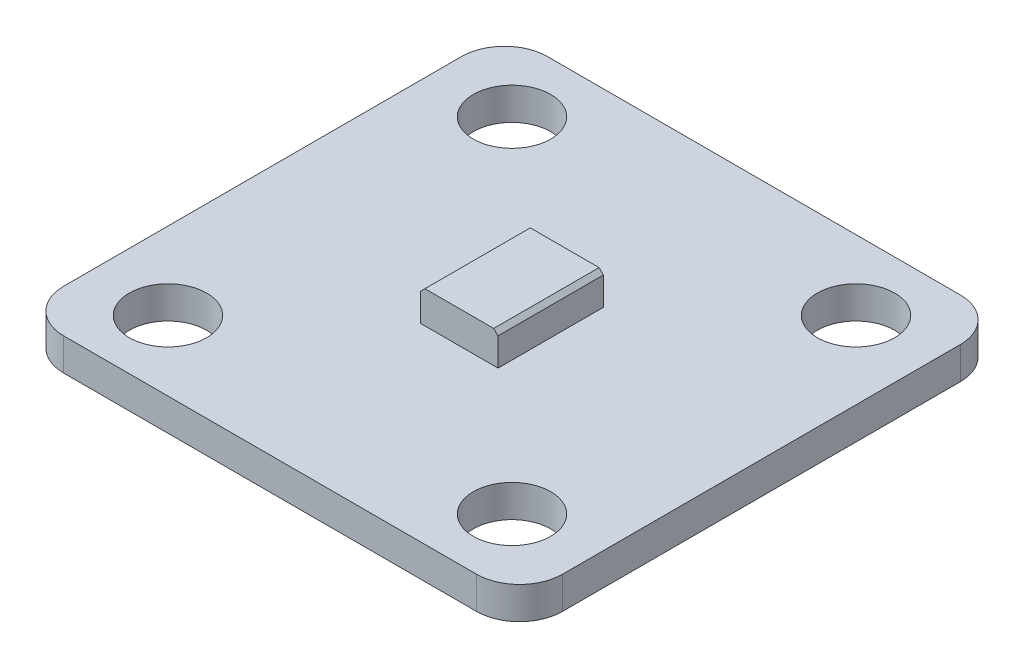
ISO-10303-21;
HEADER;
FILE_DESCRIPTION(('STEP AP214'),'2;1');
FILE_NAME('part.step','',(''),(''),'','','');
FILE_SCHEMA(('AUTOMOTIVE_DESIGN { 1 0 10303 214 1 1 1 1 }'));
ENDSEC;
DATA;
#1=APPLICATION_CONTEXT('core data for automotive mechanical design processes');
#2=APPLICATION_PROTOCOL_DEFINITION('international standard','automotive_design',2000,#1);
#3=PRODUCT_CONTEXT('',#1,'mechanical');
#4=PRODUCT('Part','Part','',(#3));
#5=PRODUCT_RELATED_PRODUCT_CATEGORY('part','',(#4));
#6=PRODUCT_DEFINITION_FORMATION('','',#4);
#7=PRODUCT_DEFINITION_CONTEXT('part definition',#1,'design');
#8=PRODUCT_DEFINITION('design','',#6,#7);
#9=PRODUCT_DEFINITION_SHAPE('','',#8);
#10=(LENGTH_UNIT() NAMED_UNIT(*) SI_UNIT(.MILLI.,.METRE.));
#11=(NAMED_UNIT(*) PLANE_ANGLE_UNIT() SI_UNIT($,.RADIAN.));
#12=(NAMED_UNIT(*) SI_UNIT($,.STERADIAN.) SOLID_ANGLE_UNIT());
#13=UNCERTAINTY_MEASURE_WITH_UNIT(LENGTH_MEASURE(1.E-05),#10,'distance_accuracy_value','');
#14=(GEOMETRIC_REPRESENTATION_CONTEXT(3) GLOBAL_UNCERTAINTY_ASSIGNED_CONTEXT((#13)) GLOBAL_UNIT_ASSIGNED_CONTEXT((#10,
#11,#12)) REPRESENTATION_CONTEXT('',''));
#15=CARTESIAN_POINT('',(0.,0.,0.));
#16=DIRECTION('',(0.,0.,1.));
#17=DIRECTION('',(1.,0.,0.));
#18=AXIS2_PLACEMENT_3D('',#15,#16,#17);
#19=CARTESIAN_POINT('',(0.,1.5,0.));
#20=DIRECTION('',(0.,1.,0.));
#21=DIRECTION('',(0.,0.,1.));
#22=AXIS2_PLACEMENT_3D('',#19,#20,#21);
#23=PLANE('',#22);
#24=CARTESIAN_POINT('',(8.,1.5,8.00000000000045));
#25=DIRECTION('',(0.,-1.,0.));
#26=DIRECTION('',(0.,0.,-1.));
#27=AXIS2_PLACEMENT_3D('',#24,#25,#26);
#28=CIRCLE('',#27,1.80000000000046);
#29=CARTESIAN_POINT('',(8.,1.5,6.19999999999999));
#30=VERTEX_POINT('',#29);
#31=EDGE_CURVE('E203',#30,#30,#28,.T.);
#32=ORIENTED_EDGE('',*,*,#31,.T.);
#33=EDGE_LOOP('',(#32));
#34=FACE_BOUND('',#33,.T.);
#35=CARTESIAN_POINT('',(-7.99999999999955,1.5,-8.00000000000001));
#36=DIRECTION('',(0.,-1.,0.));
#37=DIRECTION('',(0.,0.,-1.));
#38=AXIS2_PLACEMENT_3D('',#35,#36,#37);
#39=CIRCLE('',#38,1.80000000000024);
#40=CARTESIAN_POINT('',(-7.99999999999955,1.5,-9.80000000000024));
#41=VERTEX_POINT('',#40);
#42=EDGE_CURVE('E194',#41,#41,#39,.T.);
#43=ORIENTED_EDGE('',*,*,#42,.T.);
#44=EDGE_LOOP('',(#43));
#45=FACE_BOUND('',#44,.T.);
#46=CARTESIAN_POINT('',(8.00000000000045,1.5,-7.99999999999955));
#47=DIRECTION('',(0.,-1.,0.));
#48=DIRECTION('',(0.,0.,-1.));
#49=AXIS2_PLACEMENT_3D('',#46,#47,#48);
#50=CIRCLE('',#49,1.80000000000063);
#51=CARTESIAN_POINT('',(8.00000000000045,1.5,-9.80000000000018));
#52=VERTEX_POINT('',#51);
#53=EDGE_CURVE('E157',#52,#52,#50,.T.);
#54=ORIENTED_EDGE('',*,*,#53,.T.);
#55=EDGE_LOOP('',(#54));
#56=FACE_BOUND('',#55,.T.);
#57=CARTESIAN_POINT('',(-8.,1.5,8.));
#58=DIRECTION('',(0.,-1.,0.));
#59=DIRECTION('',(0.,0.,-1.));
#60=AXIS2_PLACEMENT_3D('',#57,#58,#59);
#61=CIRCLE('',#60,1.8);
#62=CARTESIAN_POINT('',(-8.,1.5,6.2));
#63=VERTEX_POINT('',#62);
#64=EDGE_CURVE('E214',#63,#63,#61,.T.);
#65=ORIENTED_EDGE('',*,*,#64,.T.);
#66=EDGE_LOOP('',(#65));
#67=FACE_BOUND('',#66,.T.);
#68=DIRECTION('',(-1.,0.,0.));
#69=VECTOR('',#68,1.);
#70=CARTESIAN_POINT('',(-11.6,1.5,-11.25));
#71=LINE('',#70,#69);
#72=CARTESIAN_POINT('',(9.59999999999999,1.5,-11.25));
#73=VERTEX_POINT('',#72);
#74=CARTESIAN_POINT('',(-9.6,1.5,-11.25));
#75=VERTEX_POINT('',#74);
#76=EDGE_CURVE('E226',#73,#75,#71,.T.);
#77=ORIENTED_EDGE('',*,*,#76,.T.);
#78=CARTESIAN_POINT('',(-9.6,1.5,-9.25));
#79=DIRECTION('',(0.,1.,0.));
#80=DIRECTION('',(0.,0.,1.));
#81=AXIS2_PLACEMENT_3D('',#78,#79,#80);
#82=CIRCLE('',#81,2.);
#83=CARTESIAN_POINT('',(-11.6,1.5,-9.25000000000001));
#84=VERTEX_POINT('',#83);
#85=EDGE_CURVE('E288',#75,#84,#82,.T.);
#86=ORIENTED_EDGE('',*,*,#85,.T.);
#87=DIRECTION('',(0.,0.,1.));
#88=VECTOR('',#87,1.);
#89=CARTESIAN_POINT('',(-11.6,1.5,-11.25));
#90=LINE('',#89,#88);
#91=CARTESIAN_POINT('',(-11.6,1.5,9.24999999999999));
#92=VERTEX_POINT('',#91);
#93=EDGE_CURVE('E231',#84,#92,#90,.T.);
#94=ORIENTED_EDGE('',*,*,#93,.T.);
#95=CARTESIAN_POINT('',(-9.6,1.5,9.25));
#96=DIRECTION('',(0.,1.,0.));
#97=DIRECTION('',(0.,0.,1.));
#98=AXIS2_PLACEMENT_3D('',#95,#96,#97);
#99=CIRCLE('',#98,2.);
#100=CARTESIAN_POINT('',(-9.6,1.5,11.25));
#101=VERTEX_POINT('',#100);
#102=EDGE_CURVE('E282',#92,#101,#99,.T.);
#103=ORIENTED_EDGE('',*,*,#102,.T.);
#104=DIRECTION('',(1.,0.,0.));
#105=VECTOR('',#104,1.);
#106=CARTESIAN_POINT('',(-11.6,1.5,11.25));
#107=LINE('',#106,#105);
#108=CARTESIAN_POINT('',(9.6,1.5,11.25));
#109=VERTEX_POINT('',#108);
#110=EDGE_CURVE('E235',#101,#109,#107,.T.);
#111=ORIENTED_EDGE('',*,*,#110,.T.);
#112=CARTESIAN_POINT('',(9.6,1.5,9.24999999999999));
#113=DIRECTION('',(0.,1.,0.));
#114=DIRECTION('',(0.,0.,1.));
#115=AXIS2_PLACEMENT_3D('',#112,#113,#114);
#116=CIRCLE('',#115,2.);
#117=CARTESIAN_POINT('',(11.6,1.5,9.24999999999999));
#118=VERTEX_POINT('',#117);
#119=EDGE_CURVE('E279',#109,#118,#116,.T.);
#120=ORIENTED_EDGE('',*,*,#119,.T.);
#121=DIRECTION('',(0.,0.,-1.));
#122=VECTOR('',#121,1.);
#123=CARTESIAN_POINT('',(11.6,1.5,-11.25));
#124=LINE('',#123,#122);
#125=CARTESIAN_POINT('',(11.6,1.5,-9.25000000000001));
#126=VERTEX_POINT('',#125);
#127=EDGE_CURVE('E222',#118,#126,#124,.T.);
#128=ORIENTED_EDGE('',*,*,#127,.T.);
#129=CARTESIAN_POINT('',(9.59999999999999,1.5,-9.25));
#130=DIRECTION('',(0.,1.,0.));
#131=DIRECTION('',(0.,0.,1.));
#132=AXIS2_PLACEMENT_3D('',#129,#130,#131);
#133=CIRCLE('',#132,2.);
#134=EDGE_CURVE('E285',#126,#73,#133,.T.);
#135=ORIENTED_EDGE('',*,*,#134,.T.);
#136=EDGE_LOOP('',(#77,#86,#94,#103,#111,#120,#128,#135));
#137=FACE_BOUND('',#136,.T.);
#138=DIRECTION('',(-1.,0.,0.));
#139=VECTOR('',#138,1.);
#140=CARTESIAN_POINT('',(-1.8,1.5,-2.45));
#141=LINE('',#140,#139);
#142=CARTESIAN_POINT('',(1.8,1.5,-2.45));
#143=VERTEX_POINT('',#142);
#144=CARTESIAN_POINT('',(-1.8,1.5,-2.45));
#145=VERTEX_POINT('',#144);
#146=EDGE_CURVE('E153',#143,#145,#141,.T.);
#147=ORIENTED_EDGE('',*,*,#146,.F.);
#148=DIRECTION('',(0.,0.,-1.));
#149=VECTOR('',#148,1.);
#150=CARTESIAN_POINT('',(1.8,1.5,-2.45));
#151=LINE('',#150,#149);
#152=CARTESIAN_POINT('',(1.8,1.5,2.45));
#153=VERTEX_POINT('',#152);
#154=EDGE_CURVE('E161',#153,#143,#151,.T.);
#155=ORIENTED_EDGE('',*,*,#154,.F.);
#156=DIRECTION('',(1.,0.,0.));
#157=VECTOR('',#156,1.);
#158=CARTESIAN_POINT('',(-1.8,1.5,2.45));
#159=LINE('',#158,#157);
#160=CARTESIAN_POINT('',(-1.8,1.5,2.45));
#161=VERTEX_POINT('',#160);
#162=EDGE_CURVE('E175',#161,#153,#159,.T.);
#163=ORIENTED_EDGE('',*,*,#162,.F.);
#164=DIRECTION('',(0.,0.,1.));
#165=VECTOR('',#164,1.);
#166=CARTESIAN_POINT('',(-1.8,1.5,-2.45));
#167=LINE('',#166,#165);
#168=EDGE_CURVE('E171',#145,#161,#167,.T.);
#169=ORIENTED_EDGE('',*,*,#168,.F.);
#170=EDGE_LOOP('',(#147,#155,#163,#169));
#171=FACE_BOUND('',#170,.T.);
#172=ADVANCED_FACE('F45',(#34,#45,#56,#67,#137,#171),#23,.T.);
#173=CARTESIAN_POINT('',(11.6,1.5,-11.25));
#174=DIRECTION('',(-1.,0.,0.));
#175=DIRECTION('',(0.,0.,1.));
#176=AXIS2_PLACEMENT_3D('',#173,#174,#175);
#177=PLANE('',#176);
#178=DIRECTION('',(0.,0.,-1.));
#179=VECTOR('',#178,1.);
#180=CARTESIAN_POINT('',(11.6,0.,-11.25));
#181=LINE('',#180,#179);
#182=CARTESIAN_POINT('',(11.6,0.,9.24999999999999));
#183=VERTEX_POINT('',#182);
#184=CARTESIAN_POINT('',(11.6,0.,-9.25000000000001));
#185=VERTEX_POINT('',#184);
#186=EDGE_CURVE('E218',#183,#185,#181,.T.);
#187=ORIENTED_EDGE('',*,*,#186,.T.);
#188=DIRECTION('',(0.,-1.,0.));
#189=VECTOR('',#188,1.);
#190=CARTESIAN_POINT('',(11.6,1.5,-9.25));
#191=LINE('',#190,#189);
#192=EDGE_CURVE('E295',#185,#126,#191,.F.);
#193=ORIENTED_EDGE('',*,*,#192,.T.);
#194=ORIENTED_EDGE('',*,*,#127,.F.);
#195=DIRECTION('',(0.,-1.,0.));
#196=VECTOR('',#195,1.);
#197=CARTESIAN_POINT('',(11.6,1.5,9.24999999999999));
#198=LINE('',#197,#196);
#199=EDGE_CURVE('E291',#118,#183,#198,.T.);
#200=ORIENTED_EDGE('',*,*,#199,.T.);
#201=EDGE_LOOP('',(#187,#193,#194,#200));
#202=FACE_BOUND('',#201,.T.);
#203=ADVANCED_FACE('F344',(#202),#177,.F.);
#204=CARTESIAN_POINT('',(-11.6,1.5,-11.25));
#205=DIRECTION('',(0.,0.,1.));
#206=DIRECTION('',(1.,0.,0.));
#207=AXIS2_PLACEMENT_3D('',#204,#205,#206);
#208=PLANE('',#207);
#209=DIRECTION('',(-1.,0.,0.));
#210=VECTOR('',#209,1.);
#211=CARTESIAN_POINT('',(-11.6,0.,-11.25));
#212=LINE('',#211,#210);
#213=CARTESIAN_POINT('',(9.59999999999999,0.,-11.25));
#214=VERTEX_POINT('',#213);
#215=CARTESIAN_POINT('',(-9.6,0.,-11.25));
#216=VERTEX_POINT('',#215);
#217=EDGE_CURVE('E243',#214,#216,#212,.T.);
#218=ORIENTED_EDGE('',*,*,#217,.T.);
#219=DIRECTION('',(0.,-1.,0.));
#220=VECTOR('',#219,1.);
#221=CARTESIAN_POINT('',(-9.6,1.5,-11.25));
#222=LINE('',#221,#220);
#223=EDGE_CURVE('E276',#216,#75,#222,.F.);
#224=ORIENTED_EDGE('',*,*,#223,.T.);
#225=ORIENTED_EDGE('',*,*,#76,.F.);
#226=DIRECTION('',(0.,-1.,0.));
#227=VECTOR('',#226,1.);
#228=CARTESIAN_POINT('',(9.59999999999999,1.5,-11.25));
#229=LINE('',#228,#227);
#230=EDGE_CURVE('E272',#73,#214,#229,.T.);
#231=ORIENTED_EDGE('',*,*,#230,.T.);
#232=EDGE_LOOP('',(#218,#224,#225,#231));
#233=FACE_BOUND('',#232,.T.);
#234=ADVANCED_FACE('F350',(#233),#208,.F.);
#235=CARTESIAN_POINT('',(-11.6,1.5,-11.25));
#236=DIRECTION('',(1.,0.,0.));
#237=DIRECTION('',(0.,0.,-1.));
#238=AXIS2_PLACEMENT_3D('',#235,#236,#237);
#239=PLANE('',#238);
#240=ORIENTED_EDGE('',*,*,#93,.F.);
#241=DIRECTION('',(0.,-1.,0.));
#242=VECTOR('',#241,1.);
#243=CARTESIAN_POINT('',(-11.6,1.5,-9.25));
#244=LINE('',#243,#242);
#245=CARTESIAN_POINT('',(-11.6,0.,-9.25000000000001));
#246=VERTEX_POINT('',#245);
#247=EDGE_CURVE('E256',#84,#246,#244,.T.);
#248=ORIENTED_EDGE('',*,*,#247,.T.);
#249=DIRECTION('',(0.,0.,1.));
#250=VECTOR('',#249,1.);
#251=CARTESIAN_POINT('',(-11.6,0.,-11.25));
#252=LINE('',#251,#250);
#253=CARTESIAN_POINT('',(-11.6,0.,9.24999999999999));
#254=VERTEX_POINT('',#253);
#255=EDGE_CURVE('E247',#246,#254,#252,.T.);
#256=ORIENTED_EDGE('',*,*,#255,.T.);
#257=DIRECTION('',(0.,-1.,0.));
#258=VECTOR('',#257,1.);
#259=CARTESIAN_POINT('',(-11.6,1.5,9.24999999999999));
#260=LINE('',#259,#258);
#261=EDGE_CURVE('E239',#254,#92,#260,.F.);
#262=ORIENTED_EDGE('',*,*,#261,.T.);
#263=EDGE_LOOP('',(#240,#248,#256,#262));
#264=FACE_BOUND('',#263,.T.);
#265=ADVANCED_FACE('F366',(#264),#239,.F.);
#266=CARTESIAN_POINT('',(-11.6,1.5,11.25));
#267=DIRECTION('',(0.,0.,-1.));
#268=DIRECTION('',(-1.,0.,0.));
#269=AXIS2_PLACEMENT_3D('',#266,#267,#268);
#270=PLANE('',#269);
#271=ORIENTED_EDGE('',*,*,#110,.F.);
#272=DIRECTION('',(0.,-1.,0.));
#273=VECTOR('',#272,1.);
#274=CARTESIAN_POINT('',(-9.6,1.5,11.25));
#275=LINE('',#274,#273);
#276=CARTESIAN_POINT('',(-9.6,0.,11.25));
#277=VERTEX_POINT('',#276);
#278=EDGE_CURVE('E301',#101,#277,#275,.T.);
#279=ORIENTED_EDGE('',*,*,#278,.T.);
#280=DIRECTION('',(1.,0.,0.));
#281=VECTOR('',#280,1.);
#282=CARTESIAN_POINT('',(-11.6,0.,11.25));
#283=LINE('',#282,#281);
#284=CARTESIAN_POINT('',(9.6,0.,11.25));
#285=VERTEX_POINT('',#284);
#286=EDGE_CURVE('E227',#277,#285,#283,.T.);
#287=ORIENTED_EDGE('',*,*,#286,.T.);
#288=DIRECTION('',(0.,-1.,0.));
#289=VECTOR('',#288,1.);
#290=CARTESIAN_POINT('',(9.6,1.5,11.25));
#291=LINE('',#290,#289);
#292=EDGE_CURVE('E298',#285,#109,#291,.F.);
#293=ORIENTED_EDGE('',*,*,#292,.T.);
#294=EDGE_LOOP('',(#271,#279,#287,#293));
#295=FACE_BOUND('',#294,.T.);
#296=ADVANCED_FACE('F362',(#295),#270,.F.);
#297=CARTESIAN_POINT('',(0.,0.,0.));
#298=DIRECTION('',(0.,1.,0.));
#299=DIRECTION('',(0.,0.,1.));
#300=AXIS2_PLACEMENT_3D('',#297,#298,#299);
#301=PLANE('',#300);
#302=CARTESIAN_POINT('',(0.,0.,0.));
#303=DIRECTION('',(0.,-1.,0.));
#304=DIRECTION('',(0.,0.,-1.));
#305=AXIS2_PLACEMENT_3D('',#302,#303,#304);
#306=CIRCLE('',#305,0.5);
#307=CARTESIAN_POINT('',(0.,0.,-0.5));
#308=VERTEX_POINT('',#307);
#309=EDGE_CURVE('E472',#308,#308,#306,.T.);
#310=ORIENTED_EDGE('',*,*,#309,.F.);
#311=EDGE_LOOP('',(#310));
#312=FACE_BOUND('',#311,.T.);
#313=CARTESIAN_POINT('',(8.,0.,8.00000000000045));
#314=DIRECTION('',(0.,-1.,0.));
#315=DIRECTION('',(0.,0.,-1.));
#316=AXIS2_PLACEMENT_3D('',#313,#314,#315);
#317=CIRCLE('',#316,1.80000000000046);
#318=CARTESIAN_POINT('',(8.,0.,6.19999999999999));
#319=VERTEX_POINT('',#318);
#320=EDGE_CURVE('E198',#319,#319,#317,.T.);
#321=ORIENTED_EDGE('',*,*,#320,.F.);
#322=EDGE_LOOP('',(#321));
#323=FACE_BOUND('',#322,.T.);
#324=CARTESIAN_POINT('',(-7.99999999999955,0.,-8.00000000000001));
#325=DIRECTION('',(0.,-1.,0.));
#326=DIRECTION('',(0.,0.,-1.));
#327=AXIS2_PLACEMENT_3D('',#324,#325,#326);
#328=CIRCLE('',#327,1.80000000000024);
#329=CARTESIAN_POINT('',(-7.99999999999955,0.,-9.80000000000024));
#330=VERTEX_POINT('',#329);
#331=EDGE_CURVE('E207',#330,#330,#328,.T.);
#332=ORIENTED_EDGE('',*,*,#331,.F.);
#333=EDGE_LOOP('',(#332));
#334=FACE_BOUND('',#333,.T.);
#335=CARTESIAN_POINT('',(8.00000000000045,0.,-7.99999999999955));
#336=DIRECTION('',(0.,-1.,0.));
#337=DIRECTION('',(0.,0.,-1.));
#338=AXIS2_PLACEMENT_3D('',#335,#336,#337);
#339=CIRCLE('',#338,1.80000000000063);
#340=CARTESIAN_POINT('',(8.00000000000045,0.,-9.80000000000018));
#341=VERTEX_POINT('',#340);
#342=EDGE_CURVE('E190',#341,#341,#339,.T.);
#343=ORIENTED_EDGE('',*,*,#342,.F.);
#344=EDGE_LOOP('',(#343));
#345=FACE_BOUND('',#344,.T.);
#346=CARTESIAN_POINT('',(-8.,0.,8.));
#347=DIRECTION('',(0.,-1.,0.));
#348=DIRECTION('',(0.,0.,-1.));
#349=AXIS2_PLACEMENT_3D('',#346,#347,#348);
#350=CIRCLE('',#349,1.8);
#351=CARTESIAN_POINT('',(-8.,0.,6.2));
#352=VERTEX_POINT('',#351);
#353=EDGE_CURVE('E202',#352,#352,#350,.T.);
#354=ORIENTED_EDGE('',*,*,#353,.F.);
#355=EDGE_LOOP('',(#354));
#356=FACE_BOUND('',#355,.T.);
#357=ORIENTED_EDGE('',*,*,#255,.F.);
#358=CARTESIAN_POINT('',(-9.6,0.,-9.25));
#359=DIRECTION('',(0.,1.,0.));
#360=DIRECTION('',(0.,0.,1.));
#361=AXIS2_PLACEMENT_3D('',#358,#359,#360);
#362=CIRCLE('',#361,2.);
#363=EDGE_CURVE('E269',#246,#216,#362,.F.);
#364=ORIENTED_EDGE('',*,*,#363,.T.);
#365=ORIENTED_EDGE('',*,*,#217,.F.);
#366=CARTESIAN_POINT('',(9.59999999999999,0.,-9.25));
#367=DIRECTION('',(0.,1.,0.));
#368=DIRECTION('',(0.,0.,1.));
#369=AXIS2_PLACEMENT_3D('',#366,#367,#368);
#370=CIRCLE('',#369,2.);
#371=EDGE_CURVE('E266',#214,#185,#370,.F.);
#372=ORIENTED_EDGE('',*,*,#371,.T.);
#373=ORIENTED_EDGE('',*,*,#186,.F.);
#374=CARTESIAN_POINT('',(9.6,0.,9.24999999999999));
#375=DIRECTION('',(0.,1.,0.));
#376=DIRECTION('',(0.,0.,1.));
#377=AXIS2_PLACEMENT_3D('',#374,#375,#376);
#378=CIRCLE('',#377,2.);
#379=EDGE_CURVE('E260',#183,#285,#378,.F.);
#380=ORIENTED_EDGE('',*,*,#379,.T.);
#381=ORIENTED_EDGE('',*,*,#286,.F.);
#382=CARTESIAN_POINT('',(-9.6,0.,9.25));
#383=DIRECTION('',(0.,1.,0.));
#384=DIRECTION('',(0.,0.,1.));
#385=AXIS2_PLACEMENT_3D('',#382,#383,#384);
#386=CIRCLE('',#385,2.);
#387=EDGE_CURVE('E263',#277,#254,#386,.F.);
#388=ORIENTED_EDGE('',*,*,#387,.T.);
#389=EDGE_LOOP('',(#357,#364,#365,#372,#373,#380,#381,#388));
#390=FACE_BOUND('',#389,.T.);
#391=ADVANCED_FACE('F358',(#312,#323,#334,#345,#356,#390),#301,.F.);
#392=CARTESIAN_POINT('',(-9.6,1.5,-9.25));
#393=DIRECTION('',(0.,-1.,0.));
#394=DIRECTION('',(0.,0.,-1.));
#395=AXIS2_PLACEMENT_3D('',#392,#393,#394);
#396=CYLINDRICAL_SURFACE('',#395,2.);
#397=ORIENTED_EDGE('',*,*,#85,.F.);
#398=ORIENTED_EDGE('',*,*,#223,.F.);
#399=ORIENTED_EDGE('',*,*,#363,.F.);
#400=ORIENTED_EDGE('',*,*,#247,.F.);
#401=EDGE_LOOP('',(#397,#398,#399,#400));
#402=FACE_BOUND('',#401,.T.);
#403=ADVANCED_FACE('F361',(#402),#396,.T.);
#404=CARTESIAN_POINT('',(9.59999999999999,1.5,-9.25));
#405=DIRECTION('',(0.,-1.,0.));
#406=DIRECTION('',(0.,0.,-1.));
#407=AXIS2_PLACEMENT_3D('',#404,#405,#406);
#408=CYLINDRICAL_SURFACE('',#407,2.);
#409=ORIENTED_EDGE('',*,*,#134,.F.);
#410=ORIENTED_EDGE('',*,*,#192,.F.);
#411=ORIENTED_EDGE('',*,*,#371,.F.);
#412=ORIENTED_EDGE('',*,*,#230,.F.);
#413=EDGE_LOOP('',(#409,#410,#411,#412));
#414=FACE_BOUND('',#413,.T.);
#415=ADVANCED_FACE('F376',(#414),#408,.T.);
#416=CARTESIAN_POINT('',(-9.6,1.5,9.25));
#417=DIRECTION('',(0.,-1.,0.));
#418=DIRECTION('',(0.,0.,-1.));
#419=AXIS2_PLACEMENT_3D('',#416,#417,#418);
#420=CYLINDRICAL_SURFACE('',#419,2.);
#421=ORIENTED_EDGE('',*,*,#102,.F.);
#422=ORIENTED_EDGE('',*,*,#261,.F.);
#423=ORIENTED_EDGE('',*,*,#387,.F.);
#424=ORIENTED_EDGE('',*,*,#278,.F.);
#425=EDGE_LOOP('',(#421,#422,#423,#424));
#426=FACE_BOUND('',#425,.T.);
#427=ADVANCED_FACE('F380',(#426),#420,.T.);
#428=CARTESIAN_POINT('',(9.6,1.5,9.24999999999999));
#429=DIRECTION('',(0.,-1.,0.));
#430=DIRECTION('',(0.,0.,-1.));
#431=AXIS2_PLACEMENT_3D('',#428,#429,#430);
#432=CYLINDRICAL_SURFACE('',#431,2.);
#433=ORIENTED_EDGE('',*,*,#119,.F.);
#434=ORIENTED_EDGE('',*,*,#292,.F.);
#435=ORIENTED_EDGE('',*,*,#379,.F.);
#436=ORIENTED_EDGE('',*,*,#199,.F.);
#437=EDGE_LOOP('',(#433,#434,#435,#436));
#438=FACE_BOUND('',#437,.T.);
#439=ADVANCED_FACE('F383',(#438),#432,.T.);
#440=CARTESIAN_POINT('',(-8.,1.5,8.));
#441=DIRECTION('',(0.,-1.,0.));
#442=DIRECTION('',(0.,0.,-1.));
#443=AXIS2_PLACEMENT_3D('',#440,#441,#442);
#444=CYLINDRICAL_SURFACE('',#443,1.8);
#445=ORIENTED_EDGE('',*,*,#64,.F.);
#446=EDGE_LOOP('',(#445));
#447=FACE_BOUND('',#446,.T.);
#448=ORIENTED_EDGE('',*,*,#353,.T.);
#449=EDGE_LOOP('',(#448));
#450=FACE_BOUND('',#449,.T.);
#451=ADVANCED_FACE('F356',(#447,#450),#444,.F.);
#452=CARTESIAN_POINT('',(8.00000000000045,1.5,-7.99999999999955));
#453=DIRECTION('',(0.,-1.,0.));
#454=DIRECTION('',(0.,0.,-1.));
#455=AXIS2_PLACEMENT_3D('',#452,#453,#454);
#456=CYLINDRICAL_SURFACE('',#455,1.80000000000063);
#457=ORIENTED_EDGE('',*,*,#53,.F.);
#458=EDGE_LOOP('',(#457));
#459=FACE_BOUND('',#458,.T.);
#460=ORIENTED_EDGE('',*,*,#342,.T.);
#461=EDGE_LOOP('',(#460));
#462=FACE_BOUND('',#461,.T.);
#463=ADVANCED_FACE('F390',(#459,#462),#456,.F.);
#464=CARTESIAN_POINT('',(-7.99999999999955,1.5,-8.00000000000001));
#465=DIRECTION('',(0.,-1.,0.));
#466=DIRECTION('',(0.,0.,-1.));
#467=AXIS2_PLACEMENT_3D('',#464,#465,#466);
#468=CYLINDRICAL_SURFACE('',#467,1.80000000000024);
#469=ORIENTED_EDGE('',*,*,#42,.F.);
#470=EDGE_LOOP('',(#469));
#471=FACE_BOUND('',#470,.T.);
#472=ORIENTED_EDGE('',*,*,#331,.T.);
#473=EDGE_LOOP('',(#472));
#474=FACE_BOUND('',#473,.T.);
#475=ADVANCED_FACE('F417',(#471,#474),#468,.F.);
#476=CARTESIAN_POINT('',(8.,1.5,8.00000000000045));
#477=DIRECTION('',(0.,-1.,0.));
#478=DIRECTION('',(0.,0.,-1.));
#479=AXIS2_PLACEMENT_3D('',#476,#477,#478);
#480=CYLINDRICAL_SURFACE('',#479,1.80000000000046);
#481=ORIENTED_EDGE('',*,*,#31,.F.);
#482=EDGE_LOOP('',(#481));
#483=FACE_BOUND('',#482,.T.);
#484=ORIENTED_EDGE('',*,*,#320,.T.);
#485=EDGE_LOOP('',(#484));
#486=FACE_BOUND('',#485,.T.);
#487=ADVANCED_FACE('F428',(#483,#486),#480,.F.);
#488=CARTESIAN_POINT('',(1.8,3.,-2.45));
#489=DIRECTION('',(-1.,0.,0.));
#490=DIRECTION('',(0.,0.,1.));
#491=AXIS2_PLACEMENT_3D('',#488,#489,#490);
#492=PLANE('',#491);
#493=DIRECTION('',(0.,-1.,0.));
#494=VECTOR('',#493,1.);
#495=CARTESIAN_POINT('',(1.8,3.,-2.45));
#496=LINE('',#495,#494);
#497=CARTESIAN_POINT('',(1.8,2.8,-2.45));
#498=VERTEX_POINT('',#497);
#499=EDGE_CURVE('E147',#498,#143,#496,.T.);
#500=ORIENTED_EDGE('',*,*,#499,.F.);
#501=DIRECTION('',(0.,0.,1.));
#502=VECTOR('',#501,1.);
#503=CARTESIAN_POINT('',(1.8,2.8,2.45));
#504=LINE('',#503,#502);
#505=CARTESIAN_POINT('',(1.8,2.8,2.45));
#506=VERTEX_POINT('',#505);
#507=EDGE_CURVE('E70',#498,#506,#504,.T.);
#508=ORIENTED_EDGE('',*,*,#507,.T.);
#509=DIRECTION('',(0.,-1.,0.));
#510=VECTOR('',#509,1.);
#511=CARTESIAN_POINT('',(1.8,3.,2.45));
#512=LINE('',#511,#510);
#513=EDGE_CURVE('E163',#506,#153,#512,.T.);
#514=ORIENTED_EDGE('',*,*,#513,.T.);
#515=ORIENTED_EDGE('',*,*,#154,.T.);
#516=EDGE_LOOP('',(#500,#508,#514,#515));
#517=FACE_BOUND('',#516,.T.);
#518=ADVANCED_FACE('F162',(#517),#492,.F.);
#519=CARTESIAN_POINT('',(-1.8,3.,-2.45));
#520=DIRECTION('',(0.,0.,1.));
#521=DIRECTION('',(1.,0.,0.));
#522=AXIS2_PLACEMENT_3D('',#519,#520,#521);
#523=PLANE('',#522);
#524=DIRECTION('',(-1.,0.,0.));
#525=VECTOR('',#524,1.);
#526=CARTESIAN_POINT('',(-1.8,3.,-2.45));
#527=LINE('',#526,#525);
#528=CARTESIAN_POINT('',(1.6,3.,-2.45));
#529=VERTEX_POINT('',#528);
#530=CARTESIAN_POINT('',(-1.6,3.,-2.45));
#531=VERTEX_POINT('',#530);
#532=EDGE_CURVE('E181',#529,#531,#527,.T.);
#533=ORIENTED_EDGE('',*,*,#532,.F.);
#534=DIRECTION('',(0.707106781186548,-0.707106781186547,0.));
#535=VECTOR('',#534,1.);
#536=CARTESIAN_POINT('',(1.6,3.,-2.45));
#537=LINE('',#536,#535);
#538=EDGE_CURVE('E155',#529,#498,#537,.T.);
#539=ORIENTED_EDGE('',*,*,#538,.T.);
#540=ORIENTED_EDGE('',*,*,#499,.T.);
#541=ORIENTED_EDGE('',*,*,#146,.T.);
#542=DIRECTION('',(0.,-1.,0.));
#543=VECTOR('',#542,1.);
#544=CARTESIAN_POINT('',(-1.8,3.,-2.45));
#545=LINE('',#544,#543);
#546=CARTESIAN_POINT('',(-1.8,2.8,-2.45));
#547=VERTEX_POINT('',#546);
#548=EDGE_CURVE('E158',#547,#145,#545,.T.);
#549=ORIENTED_EDGE('',*,*,#548,.F.);
#550=DIRECTION('',(0.707106781186547,0.707106781186548,0.));
#551=VECTOR('',#550,1.);
#552=CARTESIAN_POINT('',(-1.6,3.,-2.45));
#553=LINE('',#552,#551);
#554=EDGE_CURVE('E313',#547,#531,#553,.T.);
#555=ORIENTED_EDGE('',*,*,#554,.T.);
#556=EDGE_LOOP('',(#533,#539,#540,#541,#549,#555));
#557=FACE_BOUND('',#556,.T.);
#558=ADVANCED_FACE('F150',(#557),#523,.F.);
#559=CARTESIAN_POINT('',(-1.8,3.,-2.45));
#560=DIRECTION('',(1.,0.,0.));
#561=DIRECTION('',(0.,0.,-1.));
#562=AXIS2_PLACEMENT_3D('',#559,#560,#561);
#563=PLANE('',#562);
#564=DIRECTION('',(0.,-1.,0.));
#565=VECTOR('',#564,1.);
#566=CARTESIAN_POINT('',(-1.8,3.,2.45));
#567=LINE('',#566,#565);
#568=CARTESIAN_POINT('',(-1.8,2.8,2.45));
#569=VERTEX_POINT('',#568);
#570=EDGE_CURVE('E184',#569,#161,#567,.T.);
#571=ORIENTED_EDGE('',*,*,#570,.F.);
#572=DIRECTION('',(0.,0.,-1.));
#573=VECTOR('',#572,1.);
#574=CARTESIAN_POINT('',(-1.8,2.8,-2.45));
#575=LINE('',#574,#573);
#576=EDGE_CURVE('E11',#569,#547,#575,.T.);
#577=ORIENTED_EDGE('',*,*,#576,.T.);
#578=ORIENTED_EDGE('',*,*,#548,.T.);
#579=ORIENTED_EDGE('',*,*,#168,.T.);
#580=EDGE_LOOP('',(#571,#577,#578,#579));
#581=FACE_BOUND('',#580,.T.);
#582=ADVANCED_FACE('F452',(#581),#563,.F.);
#583=CARTESIAN_POINT('',(-1.8,3.,2.45));
#584=DIRECTION('',(0.,0.,-1.));
#585=DIRECTION('',(-1.,0.,0.));
#586=AXIS2_PLACEMENT_3D('',#583,#584,#585);
#587=PLANE('',#586);
#588=ORIENTED_EDGE('',*,*,#513,.F.);
#589=DIRECTION('',(-0.707106781186548,0.707106781186547,0.));
#590=VECTOR('',#589,1.);
#591=CARTESIAN_POINT('',(1.6,3.,2.45));
#592=LINE('',#591,#590);
#593=CARTESIAN_POINT('',(1.6,3.,2.45));
#594=VERTEX_POINT('',#593);
#595=EDGE_CURVE('E55',#506,#594,#592,.T.);
#596=ORIENTED_EDGE('',*,*,#595,.T.);
#597=DIRECTION('',(1.,0.,0.));
#598=VECTOR('',#597,1.);
#599=CARTESIAN_POINT('',(-1.8,3.,2.45));
#600=LINE('',#599,#598);
#601=CARTESIAN_POINT('',(-1.6,3.,2.45));
#602=VERTEX_POINT('',#601);
#603=EDGE_CURVE('E185',#602,#594,#600,.T.);
#604=ORIENTED_EDGE('',*,*,#603,.F.);
#605=DIRECTION('',(-0.707106781186547,-0.707106781186548,0.));
#606=VECTOR('',#605,1.);
#607=CARTESIAN_POINT('',(-1.6,3.,2.45));
#608=LINE('',#607,#606);
#609=EDGE_CURVE('E62',#602,#569,#608,.T.);
#610=ORIENTED_EDGE('',*,*,#609,.T.);
#611=ORIENTED_EDGE('',*,*,#570,.T.);
#612=ORIENTED_EDGE('',*,*,#162,.T.);
#613=EDGE_LOOP('',(#588,#596,#604,#610,#611,#612));
#614=FACE_BOUND('',#613,.T.);
#615=ADVANCED_FACE('F324',(#614),#587,.F.);
#616=CARTESIAN_POINT('',(0.,3.,0.));
#617=DIRECTION('',(0.,1.,0.));
#618=DIRECTION('',(0.,0.,1.));
#619=AXIS2_PLACEMENT_3D('',#616,#617,#618);
#620=PLANE('',#619);
#621=ORIENTED_EDGE('',*,*,#603,.T.);
#622=DIRECTION('',(0.,0.,-1.));
#623=VECTOR('',#622,1.);
#624=CARTESIAN_POINT('',(1.6,3.,-2.45));
#625=LINE('',#624,#623);
#626=EDGE_CURVE('E309',#594,#529,#625,.T.);
#627=ORIENTED_EDGE('',*,*,#626,.T.);
#628=ORIENTED_EDGE('',*,*,#532,.T.);
#629=DIRECTION('',(0.,0.,1.));
#630=VECTOR('',#629,1.);
#631=CARTESIAN_POINT('',(-1.6,3.,2.45));
#632=LINE('',#631,#630);
#633=EDGE_CURVE('E305',#531,#602,#632,.T.);
#634=ORIENTED_EDGE('',*,*,#633,.T.);
#635=EDGE_LOOP('',(#621,#627,#628,#634));
#636=FACE_BOUND('',#635,.T.);
#637=ADVANCED_FACE('F328',(#636),#620,.T.);
#638=CARTESIAN_POINT('',(1.6,3.,0.));
#639=DIRECTION('',(0.707106781186547,0.707106781186548,0.));
#640=DIRECTION('',(0.,0.,1.));
#641=AXIS2_PLACEMENT_3D('',#638,#639,#640);
#642=PLANE('',#641);
#643=ORIENTED_EDGE('',*,*,#595,.F.);
#644=ORIENTED_EDGE('',*,*,#507,.F.);
#645=ORIENTED_EDGE('',*,*,#538,.F.);
#646=ORIENTED_EDGE('',*,*,#626,.F.);
#647=EDGE_LOOP('',(#643,#644,#645,#646));
#648=FACE_BOUND('',#647,.T.);
#649=ADVANCED_FACE('F332',(#648),#642,.T.);
#650=CARTESIAN_POINT('',(-1.6,3.,0.));
#651=DIRECTION('',(-0.707106781186548,0.707106781186547,0.));
#652=DIRECTION('',(0.,0.,-1.));
#653=AXIS2_PLACEMENT_3D('',#650,#651,#652);
#654=PLANE('',#653);
#655=ORIENTED_EDGE('',*,*,#554,.F.);
#656=ORIENTED_EDGE('',*,*,#576,.F.);
#657=ORIENTED_EDGE('',*,*,#609,.F.);
#658=ORIENTED_EDGE('',*,*,#633,.F.);
#659=EDGE_LOOP('',(#655,#656,#657,#658));
#660=FACE_BOUND('',#659,.T.);
#661=ADVANCED_FACE('F48',(#660),#654,.T.);
#662=CARTESIAN_POINT('',(0.,0.1,0.));
#663=DIRECTION('',(0.,-1.,0.));
#664=DIRECTION('',(0.,0.,-1.));
#665=AXIS2_PLACEMENT_3D('',#662,#663,#664);
#666=CYLINDRICAL_SURFACE('',#665,0.5);
#667=CARTESIAN_POINT('',(0.,0.1,0.));
#668=DIRECTION('',(0.,-1.,0.));
#669=DIRECTION('',(0.,0.,-1.));
#670=AXIS2_PLACEMENT_3D('',#667,#668,#669);
#671=CIRCLE('',#670,0.5);
#672=CARTESIAN_POINT('',(0.,0.1,-0.5));
#673=VERTEX_POINT('',#672);
#674=EDGE_CURVE('E168',#673,#673,#671,.T.);
#675=ORIENTED_EDGE('',*,*,#674,.F.);
#676=EDGE_LOOP('',(#675));
#677=FACE_BOUND('',#676,.T.);
#678=ORIENTED_EDGE('',*,*,#309,.T.);
#679=EDGE_LOOP('',(#678));
#680=FACE_BOUND('',#679,.T.);
#681=ADVANCED_FACE('F338',(#677,#680),#666,.F.);
#682=CARTESIAN_POINT('',(0.,0.1,0.));
#683=DIRECTION('',(0.,-1.,0.));
#684=DIRECTION('',(0.,0.,-1.));
#685=AXIS2_PLACEMENT_3D('',#682,#683,#684);
#686=PLANE('',#685);
#687=ORIENTED_EDGE('',*,*,#674,.T.);
#688=EDGE_LOOP('',(#687));
#689=FACE_BOUND('',#688,.T.);
#690=ADVANCED_FACE('F463',(#689),#686,.T.);
#691=CLOSED_SHELL('',(#172,#203,#234,#265,#296,#391,#403,#415,#427,#439,#451,#463,#475,#487,
#518,#558,#582,#615,#637,#649,#661,#681,#690));
#692=MANIFOLD_SOLID_BREP('B2',#691);
#693=ADVANCED_BREP_SHAPE_REPRESENTATION('',(#18,#692),#14);
#694=SHAPE_DEFINITION_REPRESENTATION(#9,#693);
ENDSEC;
END-ISO-10303-21;
